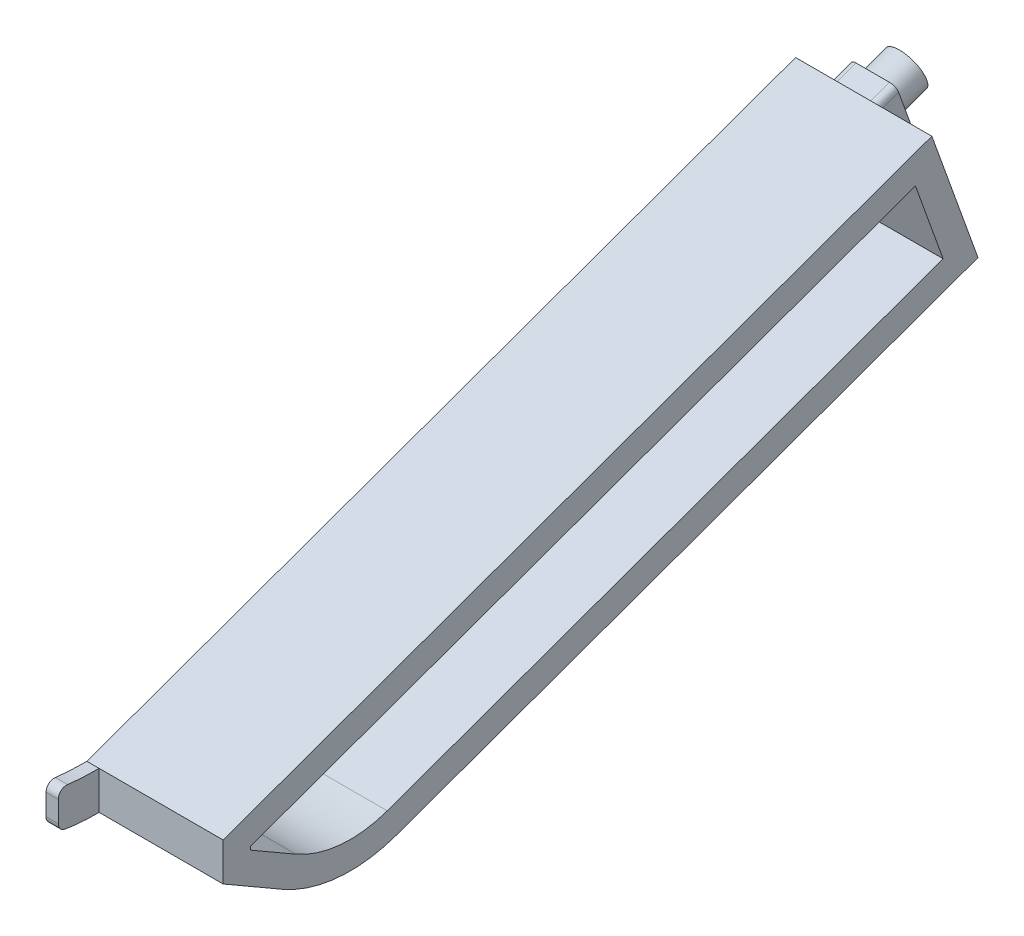
ISO-10303-21;
HEADER;
FILE_DESCRIPTION(('STEP AP214'),'2;1');
FILE_NAME('part.step','',(''),(''),'','','');
FILE_SCHEMA(('AUTOMOTIVE_DESIGN { 1 0 10303 214 1 1 1 1 }'));
ENDSEC;
DATA;
#1=APPLICATION_CONTEXT('core data for automotive mechanical design processes');
#2=APPLICATION_PROTOCOL_DEFINITION('international standard','automotive_design',2000,#1);
#3=PRODUCT_CONTEXT('',#1,'mechanical');
#4=PRODUCT('Part','Part','',(#3));
#5=PRODUCT_RELATED_PRODUCT_CATEGORY('part','',(#4));
#6=PRODUCT_DEFINITION_FORMATION('','',#4);
#7=PRODUCT_DEFINITION_CONTEXT('part definition',#1,'design');
#8=PRODUCT_DEFINITION('design','',#6,#7);
#9=PRODUCT_DEFINITION_SHAPE('','',#8);
#10=(LENGTH_UNIT() NAMED_UNIT(*) SI_UNIT(.MILLI.,.METRE.));
#11=(NAMED_UNIT(*) PLANE_ANGLE_UNIT() SI_UNIT($,.RADIAN.));
#12=(NAMED_UNIT(*) SI_UNIT($,.STERADIAN.) SOLID_ANGLE_UNIT());
#13=UNCERTAINTY_MEASURE_WITH_UNIT(LENGTH_MEASURE(1.E-05),#10,'distance_accuracy_value','');
#14=(GEOMETRIC_REPRESENTATION_CONTEXT(3) GLOBAL_UNCERTAINTY_ASSIGNED_CONTEXT((#13)) GLOBAL_UNIT_ASSIGNED_CONTEXT((#10,
#11,#12)) REPRESENTATION_CONTEXT('',''));
#15=CARTESIAN_POINT('',(0.,0.,0.));
#16=DIRECTION('',(0.,0.,1.));
#17=DIRECTION('',(1.,0.,0.));
#18=AXIS2_PLACEMENT_3D('',#15,#16,#17);
#19=CARTESIAN_POINT('',(0.,21.5231169644704,-52.00865823464));
#20=DIRECTION('',(0.,0.338719468272743,-0.940887411868727));
#21=DIRECTION('',(0.,0.940887411868727,0.338719468272743));
#22=AXIS2_PLACEMENT_3D('',#19,#20,#21);
#23=PLANE('',#22);
#24=DIRECTION('',(-1.,0.,0.));
#25=VECTOR('',#24,1.);
#26=CARTESIAN_POINT('',(3.46482322781408,15.1886756254264,-54.2890571166958));
#27=LINE('',#26,#25);
#28=CARTESIAN_POINT('',(2.96482322781408,15.1886756254264,-54.2890571166958));
#29=VERTEX_POINT('',#28);
#30=CARTESIAN_POINT('',(0.5,15.1886756254264,-54.2890571166958));
#31=VERTEX_POINT('',#30);
#32=EDGE_CURVE('E497',#29,#31,#27,.T.);
#33=ORIENTED_EDGE('',*,*,#32,.F.);
#34=CARTESIAN_POINT('',(2.96482322781408,15.6591193313608,-54.1196973825594));
#35=DIRECTION('',(0.,0.338719468272743,-0.940887411868727));
#36=DIRECTION('',(0.,0.940887411868727,0.338719468272743));
#37=AXIS2_PLACEMENT_3D('',#34,#35,#36);
#38=CIRCLE('',#37,0.5);
#39=CARTESIAN_POINT('',(3.46482322781408,15.6591193313608,-54.1196973825594));
#40=VERTEX_POINT('',#39);
#41=EDGE_CURVE('E491',#29,#40,#38,.F.);
#42=ORIENTED_EDGE('',*,*,#41,.T.);
#43=DIRECTION('',(0.,-0.940887411868726,-0.338719468272743));
#44=VECTOR('',#43,1.);
#45=CARTESIAN_POINT('',(3.46482322781408,15.1886756254264,-54.2890571166958));
#46=LINE('',#45,#44);
#47=CARTESIAN_POINT('',(3.46482322781408,17.9782404788927,-53.2848137694479));
#48=VERTEX_POINT('',#47);
#49=EDGE_CURVE('E507',#48,#40,#46,.T.);
#50=ORIENTED_EDGE('',*,*,#49,.F.);
#51=CARTESIAN_POINT('',(2.96482322781408,17.9782404788927,-53.2848137694479));
#52=DIRECTION('',(0.,0.338719468272743,-0.940887411868727));
#53=DIRECTION('',(0.,0.940887411868727,0.338719468272743));
#54=AXIS2_PLACEMENT_3D('',#51,#52,#53);
#55=CIRCLE('',#54,0.5);
#56=CARTESIAN_POINT('',(2.96482322781408,18.4486841848271,-53.1154540353116));
#57=VERTEX_POINT('',#56);
#58=EDGE_CURVE('E44',#48,#57,#55,.F.);
#59=ORIENTED_EDGE('',*,*,#58,.T.);
#60=DIRECTION('',(1.,0.,0.));
#61=VECTOR('',#60,1.);
#62=CARTESIAN_POINT('',(3.46482322781408,18.4486841848271,-53.1154540353116));
#63=LINE('',#62,#61);
#64=CARTESIAN_POINT('',(0.5,18.4486841848271,-53.1154540353116));
#65=VERTEX_POINT('',#64);
#66=EDGE_CURVE('E575',#65,#57,#63,.T.);
#67=ORIENTED_EDGE('',*,*,#66,.F.);
#68=CARTESIAN_POINT('',(0.5,17.9782404788927,-53.2848137694479));
#69=DIRECTION('',(0.,0.338719468272743,-0.940887411868727));
#70=DIRECTION('',(0.,0.940887411868727,0.338719468272743));
#71=AXIS2_PLACEMENT_3D('',#68,#69,#70);
#72=CIRCLE('',#71,0.5);
#73=CARTESIAN_POINT('',(0.,17.9782404788927,-53.2848137694479));
#74=VERTEX_POINT('',#73);
#75=EDGE_CURVE('E11',#65,#74,#72,.F.);
#76=ORIENTED_EDGE('',*,*,#75,.T.);
#77=DIRECTION('',(0.,-0.940887411868727,-0.338719468272743));
#78=VECTOR('',#77,1.);
#79=CARTESIAN_POINT('',(0.,12.1142428457831,-55.3958529173674));
#80=LINE('',#79,#78);
#81=CARTESIAN_POINT('',(0.,21.5231169644704,-52.00865823464));
#82=VERTEX_POINT('',#81);
#83=EDGE_CURVE('E416',#82,#74,#80,.T.);
#84=ORIENTED_EDGE('',*,*,#83,.F.);
#85=DIRECTION('',(1.,0.,0.));
#86=VECTOR('',#85,1.);
#87=CARTESIAN_POINT('',(-53.9186776176308,21.5231169644704,-52.00865823464));
#88=LINE('',#87,#86);
#89=CARTESIAN_POINT('',(10.,21.5231169644704,-52.00865823464));
#90=VERTEX_POINT('',#89);
#91=EDGE_CURVE('E413',#82,#90,#88,.T.);
#92=ORIENTED_EDGE('',*,*,#91,.T.);
#93=DIRECTION('',(0.,0.940887411868726,0.338719468272742));
#94=VECTOR('',#93,1.);
#95=CARTESIAN_POINT('',(10.,12.1142428457831,-55.3958529173674));
#96=LINE('',#95,#94);
#97=CARTESIAN_POINT('',(10.,12.1142428457831,-55.3958529173674));
#98=VERTEX_POINT('',#97);
#99=EDGE_CURVE('E412',#98,#90,#96,.T.);
#100=ORIENTED_EDGE('',*,*,#99,.F.);
#101=DIRECTION('',(1.,0.,0.));
#102=VECTOR('',#101,1.);
#103=CARTESIAN_POINT('',(-53.9186776176308,12.1142428457831,-55.3958529173674));
#104=LINE('',#103,#102);
#105=CARTESIAN_POINT('',(0.,12.1142428457831,-55.3958529173674));
#106=VERTEX_POINT('',#105);
#107=EDGE_CURVE('E409',#106,#98,#104,.T.);
#108=ORIENTED_EDGE('',*,*,#107,.F.);
#109=CARTESIAN_POINT('',(0.,15.6591193313608,-54.1196973825594));
#110=VERTEX_POINT('',#109);
#111=EDGE_CURVE('E400',#110,#106,#80,.T.);
#112=ORIENTED_EDGE('',*,*,#111,.F.);
#113=CARTESIAN_POINT('',(0.5,15.6591193313608,-54.1196973825594));
#114=DIRECTION('',(0.,0.338719468272743,-0.940887411868727));
#115=DIRECTION('',(0.,0.940887411868727,0.338719468272743));
#116=AXIS2_PLACEMENT_3D('',#113,#114,#115);
#117=CIRCLE('',#116,0.5);
#118=EDGE_CURVE('E493',#110,#31,#117,.F.);
#119=ORIENTED_EDGE('',*,*,#118,.T.);
#120=EDGE_LOOP('',(#33,#42,#50,#59,#67,#76,#84,#92,#100,#108,#112,#119));
#121=FACE_BOUND('',#120,.T.);
#122=ADVANCED_FACE('F36',(#121),#23,.T.);
#123=CARTESIAN_POINT('',(0.9,5.12842105263158,7.));
#124=CARTESIAN_POINT('',(0.9,1.73912121315182,6.10147264757334));
#125=CARTESIAN_POINT('',(0.9,0.,5.08826866536916));
#126=CARTESIAN_POINT('',(0.9,0.,0.));
#127=B_SPLINE_CURVE_WITH_KNOTS('',3,(#123,#124,#125,#126),.UNSPECIFIED.,.F.,.F.,(4,4),(0.,1.),.UNSPECIFIED.);
#128=DIRECTION('',(-1.,0.,0.));
#129=VECTOR('',#128,1.);
#130=SURFACE_OF_LINEAR_EXTRUSION('',#127,#129);
#131=CARTESIAN_POINT('',(0.9,0.191454914863101,2.50683189132577));
#132=VERTEX_POINT('',#131);
#133=CARTESIAN_POINT('',(0.9,0.,0.));
#134=VERTEX_POINT('',#133);
#135=EDGE_CURVE('E232',#132,#134,#127,.T.);
#136=ORIENTED_EDGE('',*,*,#135,.F.);
#137=DIRECTION('',(-1.,0.,0.));
#138=VECTOR('',#137,1.);
#139=CARTESIAN_POINT('',(0.9,0.191454914863133,2.50683189132595));
#140=LINE('',#139,#138);
#141=CARTESIAN_POINT('',(0.,0.191454914863101,2.50683189132577));
#142=VERTEX_POINT('',#141);
#143=EDGE_CURVE('E340',#132,#142,#140,.T.);
#144=ORIENTED_EDGE('',*,*,#143,.T.);
#145=CARTESIAN_POINT('',(0.,5.12842105263158,7.));
#146=CARTESIAN_POINT('',(0.,1.73912121315182,6.10147264757334));
#147=CARTESIAN_POINT('',(0.,0.,5.08826866536916));
#148=CARTESIAN_POINT('',(0.,0.,0.));
#149=B_SPLINE_CURVE_WITH_KNOTS('',3,(#145,#146,#147,#148),.UNSPECIFIED.,.F.,.F.,(4,4),(0.,1.),.UNSPECIFIED.);
#150=CARTESIAN_POINT('',(0.,0.,0.));
#151=VERTEX_POINT('',#150);
#152=EDGE_CURVE('E241',#142,#151,#149,.T.);
#153=ORIENTED_EDGE('',*,*,#152,.T.);
#154=DIRECTION('',(-1.,0.,0.));
#155=VECTOR('',#154,1.);
#156=CARTESIAN_POINT('',(0.9,0.,0.));
#157=LINE('',#156,#155);
#158=EDGE_CURVE('E234',#134,#151,#157,.T.);
#159=ORIENTED_EDGE('',*,*,#158,.F.);
#160=EDGE_LOOP('',(#136,#144,#153,#159));
#161=FACE_BOUND('',#160,.T.);
#162=ADVANCED_FACE('F256',(#161),#130,.F.);
#163=CARTESIAN_POINT('',(0.9,2.8,0.));
#164=CARTESIAN_POINT('',(0.9,2.8,3.6542139346842));
#165=CARTESIAN_POINT('',(0.9,3.43377073977233,4.55418302304701));
#166=CARTESIAN_POINT('',(0.9,5.12842105263158,7.));
#167=B_SPLINE_CURVE_WITH_KNOTS('',3,(#163,#164,#165,#166),.UNSPECIFIED.,.F.,.F.,(4,4),(0.,1.),.UNSPECIFIED.);
#168=DIRECTION('',(-1.,0.,0.));
#169=VECTOR('',#168,1.);
#170=SURFACE_OF_LINEAR_EXTRUSION('',#167,#169);
#171=CARTESIAN_POINT('',(0.,2.8,0.));
#172=CARTESIAN_POINT('',(0.,2.8,3.6542139346842));
#173=CARTESIAN_POINT('',(0.,3.43377073977233,4.55418302304701));
#174=CARTESIAN_POINT('',(0.,5.12842105263158,7.));
#175=B_SPLINE_CURVE_WITH_KNOTS('',3,(#171,#172,#173,#174),.UNSPECIFIED.,.F.,.F.,(4,4),(0.,1.),.UNSPECIFIED.);
#176=CARTESIAN_POINT('',(0.,2.8,0.));
#177=VERTEX_POINT('',#176);
#178=CARTESIAN_POINT('',(0.,2.92915290222251,2.31818913175958));
#179=VERTEX_POINT('',#178);
#180=EDGE_CURVE('E223',#177,#179,#175,.T.);
#181=ORIENTED_EDGE('',*,*,#180,.T.);
#182=DIRECTION('',(-1.,0.,0.));
#183=VECTOR('',#182,1.);
#184=CARTESIAN_POINT('',(0.,2.92915290222251,2.31818913175958));
#185=LINE('',#184,#183);
#186=CARTESIAN_POINT('',(0.9,2.92915290222251,2.31818913175958));
#187=VERTEX_POINT('',#186);
#188=EDGE_CURVE('E207',#179,#187,#185,.F.);
#189=ORIENTED_EDGE('',*,*,#188,.T.);
#190=CARTESIAN_POINT('',(0.9,2.8,0.));
#191=VERTEX_POINT('',#190);
#192=EDGE_CURVE('E221',#191,#187,#167,.T.);
#193=ORIENTED_EDGE('',*,*,#192,.F.);
#194=DIRECTION('',(-1.,0.,0.));
#195=VECTOR('',#194,1.);
#196=CARTESIAN_POINT('',(0.9,2.8,0.));
#197=LINE('',#196,#195);
#198=EDGE_CURVE('E230',#191,#177,#197,.T.);
#199=ORIENTED_EDGE('',*,*,#198,.T.);
#200=EDGE_LOOP('',(#181,#189,#193,#199));
#201=FACE_BOUND('',#200,.T.);
#202=ADVANCED_FACE('F219',(#201),#170,.F.);
#203=CARTESIAN_POINT('',(0.9,1.29322308651088,5.07115299235344));
#204=DIRECTION('',(1.,0.,0.));
#205=DIRECTION('',(0.,0.,-1.));
#206=AXIS2_PLACEMENT_3D('',#203,#204,#205);
#207=PLANE('',#206);
#208=DIRECTION('',(0.,1.,0.));
#209=VECTOR('',#208,1.);
#210=CARTESIAN_POINT('',(0.9,1.29322308651088,3.));
#211=LINE('',#210,#209);
#212=CARTESIAN_POINT('',(0.9,0.781867437592555,3.));
#213=VERTEX_POINT('',#212);
#214=CARTESIAN_POINT('',(0.9,2.33475658507565,3.));
#215=VERTEX_POINT('',#214);
#216=EDGE_CURVE('E459',#213,#215,#211,.T.);
#217=ORIENTED_EDGE('',*,*,#216,.F.);
#218=CARTESIAN_POINT('',(0.9,0.781867437592555,2.4));
#219=DIRECTION('',(1.,0.,0.));
#220=DIRECTION('',(0.,0.,-1.));
#221=AXIS2_PLACEMENT_3D('',#218,#219,#220);
#222=CIRCLE('',#221,0.6);
#223=EDGE_CURVE('E214',#213,#132,#222,.T.);
#224=ORIENTED_EDGE('',*,*,#223,.T.);
#225=ORIENTED_EDGE('',*,*,#135,.T.);
#226=DIRECTION('',(0.,1.,0.));
#227=VECTOR('',#226,1.);
#228=CARTESIAN_POINT('',(0.9,2.8,0.));
#229=LINE('',#228,#227);
#230=EDGE_CURVE('E229',#134,#191,#229,.T.);
#231=ORIENTED_EDGE('',*,*,#230,.T.);
#232=ORIENTED_EDGE('',*,*,#192,.T.);
#233=CARTESIAN_POINT('',(0.9,2.33475658507565,2.4));
#234=DIRECTION('',(1.,0.,0.));
#235=DIRECTION('',(0.,0.,-1.));
#236=AXIS2_PLACEMENT_3D('',#233,#234,#235);
#237=CIRCLE('',#236,0.6);
#238=EDGE_CURVE('E203',#187,#215,#237,.T.);
#239=ORIENTED_EDGE('',*,*,#238,.T.);
#240=EDGE_LOOP('',(#217,#224,#225,#231,#232,#239));
#241=FACE_BOUND('',#240,.T.);
#242=ADVANCED_FACE('F227',(#241),#207,.T.);
#243=CARTESIAN_POINT('',(0.,1.29322308651088,5.07115299235344));
#244=DIRECTION('',(1.,0.,0.));
#245=DIRECTION('',(0.,0.,-1.));
#246=AXIS2_PLACEMENT_3D('',#243,#244,#245);
#247=PLANE('',#246);
#248=DIRECTION('',(0.,-0.338719468272742,0.940887411868727));
#249=VECTOR('',#248,1.);
#250=CARTESIAN_POINT('',(0.,-0.870809318457205,4.29210132656493));
#251=LINE('',#250,#249);
#252=CARTESIAN_POINT('',(0.,18.9639032041874,-50.804322347448));
#253=VERTEX_POINT('',#252);
#254=CARTESIAN_POINT('',(0.,1.39434715910617,-2.));
#255=VERTEX_POINT('',#254);
#256=EDGE_CURVE('E431',#253,#255,#251,.T.);
#257=ORIENTED_EDGE('',*,*,#256,.T.);
#258=DIRECTION('',(0.,-1.,0.));
#259=VECTOR('',#258,1.);
#260=CARTESIAN_POINT('',(0.,1.29322308651088,-2.));
#261=LINE('',#260,#259);
#262=CARTESIAN_POINT('',(0.,1.15470053837925,-2.));
#263=VERTEX_POINT('',#262);
#264=EDGE_CURVE('E421',#255,#263,#261,.T.);
#265=ORIENTED_EDGE('',*,*,#264,.T.);
#266=DIRECTION('',(0.,-0.500000000000001,-0.866025403784438));
#267=VECTOR('',#266,1.);
#268=CARTESIAN_POINT('',(0.,4.25123023812438,3.36334676710454));
#269=LINE('',#268,#267);
#270=CARTESIAN_POINT('',(0.,-0.768816625641934,-5.33162945731548));
#271=VERTEX_POINT('',#270);
#272=EDGE_CURVE('E360',#263,#271,#269,.T.);
#273=ORIENTED_EDGE('',*,*,#272,.T.);
#274=CARTESIAN_POINT('',(0.,6.15938660463357,-9.33162945731548));
#275=DIRECTION('',(1.,0.,0.));
#276=DIRECTION('',(0.,0.,-1.));
#277=AXIS2_PLACEMENT_3D('',#274,#275,#276);
#278=CIRCLE('',#277,8.);
#279=CARTESIAN_POINT('',(0.,-1.36771269031624,-12.0413852034974));
#280=VERTEX_POINT('',#279);
#281=EDGE_CURVE('E357',#271,#280,#278,.T.);
#282=ORIENTED_EDGE('',*,*,#281,.T.);
#283=DIRECTION('',(0.,0.338719468272742,-0.940887411868727));
#284=VECTOR('',#283,1.);
#285=CARTESIAN_POINT('',(0.,-6.51613378966956,2.25978451692848));
#286=LINE('',#285,#284);
#287=CARTESIAN_POINT('',(0.,13.3185787329751,-52.8366391570844));
#288=VERTEX_POINT('',#287);
#289=EDGE_CURVE('E361',#280,#288,#286,.T.);
#290=ORIENTED_EDGE('',*,*,#289,.T.);
#291=DIRECTION('',(0.,0.940887411868726,0.338719468272743));
#292=VECTOR('',#291,1.);
#293=CARTESIAN_POINT('',(0.,21.1279356091556,-50.0252706816594));
#294=LINE('',#293,#292);
#295=EDGE_CURVE('E364',#288,#253,#294,.T.);
#296=ORIENTED_EDGE('',*,*,#295,.T.);
#297=EDGE_LOOP('',(#257,#265,#273,#282,#290,#296));
#298=FACE_BOUND('',#297,.T.);
#299=DIRECTION('',(0.,0.940887411868726,0.338719468272743));
#300=VECTOR('',#299,1.);
#301=CARTESIAN_POINT('',(0.,16.2048340302447,-57.111719352302));
#302=LINE('',#301,#300);
#303=CARTESIAN_POINT('',(0.,16.675277736179,-56.9423596181656));
#304=VERTEX_POINT('',#303);
#305=CARTESIAN_POINT('',(0.,18.9943988837109,-56.1074760050541));
#306=VERTEX_POINT('',#305);
#307=EDGE_CURVE('E514',#304,#306,#302,.T.);
#308=ORIENTED_EDGE('',*,*,#307,.F.);
#309=DIRECTION('',(0.,-0.338719468272743,0.940887411868727));
#310=VECTOR('',#309,1.);
#311=CARTESIAN_POINT('',(0.,-4.8530321278294,2.85850111519093));
#312=LINE('',#311,#310);
#313=EDGE_CURVE('E484',#304,#110,#312,.T.);
#314=ORIENTED_EDGE('',*,*,#313,.T.);
#315=ORIENTED_EDGE('',*,*,#111,.T.);
#316=DIRECTION('',(0.,-0.338719468272742,0.940887411868727));
#317=VECTOR('',#316,1.);
#318=CARTESIAN_POINT('',(0.,-4.82173056785397,-8.35148232393102));
#319=LINE('',#318,#317);
#320=CARTESIAN_POINT('',(0.,-3.2494875140537,-12.7188241400429));
#321=VERTEX_POINT('',#320);
#322=EDGE_CURVE('E397',#106,#321,#319,.T.);
#323=ORIENTED_EDGE('',*,*,#322,.T.);
#324=CARTESIAN_POINT('',(0.,6.15938660463357,-9.33162945731548));
#325=DIRECTION('',(1.,0.,0.));
#326=DIRECTION('',(0.,0.,-1.));
#327=AXIS2_PLACEMENT_3D('',#324,#325,#326);
#328=CIRCLE('',#327,10.);
#329=CARTESIAN_POINT('',(0.,-2.50086743321081,-4.33162945731547));
#330=VERTEX_POINT('',#329);
#331=EDGE_CURVE('E349',#321,#330,#328,.F.);
#332=ORIENTED_EDGE('',*,*,#331,.T.);
#333=DIRECTION('',(0.,-0.500000000000001,-0.866025403784438));
#334=VECTOR('',#333,1.);
#335=CARTESIAN_POINT('',(0.,0.,0.));
#336=LINE('',#335,#334);
#337=EDGE_CURVE('E391',#151,#330,#336,.T.);
#338=ORIENTED_EDGE('',*,*,#337,.F.);
#339=ORIENTED_EDGE('',*,*,#152,.F.);
#340=CARTESIAN_POINT('',(0.,0.781867437592555,2.4));
#341=DIRECTION('',(1.,0.,0.));
#342=DIRECTION('',(0.,0.,-1.));
#343=AXIS2_PLACEMENT_3D('',#340,#341,#342);
#344=CIRCLE('',#343,0.6);
#345=CARTESIAN_POINT('',(0.,0.781867437592555,3.));
#346=VERTEX_POINT('',#345);
#347=EDGE_CURVE('E348',#142,#346,#344,.F.);
#348=ORIENTED_EDGE('',*,*,#347,.T.);
#349=DIRECTION('',(0.,-1.,0.));
#350=VECTOR('',#349,1.);
#351=CARTESIAN_POINT('',(0.,-0.988739395943905,3.));
#352=LINE('',#351,#350);
#353=CARTESIAN_POINT('',(0.,2.33475658507565,3.));
#354=VERTEX_POINT('',#353);
#355=EDGE_CURVE('E461',#354,#346,#352,.T.);
#356=ORIENTED_EDGE('',*,*,#355,.F.);
#357=CARTESIAN_POINT('',(0.,2.33475658507565,2.4));
#358=DIRECTION('',(1.,0.,0.));
#359=DIRECTION('',(0.,0.,-1.));
#360=AXIS2_PLACEMENT_3D('',#357,#358,#359);
#361=CIRCLE('',#360,0.6);
#362=EDGE_CURVE('E350',#354,#179,#361,.F.);
#363=ORIENTED_EDGE('',*,*,#362,.T.);
#364=ORIENTED_EDGE('',*,*,#180,.F.);
#365=DIRECTION('',(0.,-0.338719468272742,0.940887411868727));
#366=VECTOR('',#365,1.);
#367=CARTESIAN_POINT('',(0.,10.,-20.));
#368=LINE('',#367,#366);
#369=EDGE_CURVE('E403',#82,#177,#368,.T.);
#370=ORIENTED_EDGE('',*,*,#369,.F.);
#371=ORIENTED_EDGE('',*,*,#83,.T.);
#372=DIRECTION('',(0.,-0.338719468272743,0.940887411868727));
#373=VECTOR('',#372,1.);
#374=CARTESIAN_POINT('',(0.,-2.53391098029749,3.69338472830242));
#375=LINE('',#374,#373);
#376=EDGE_CURVE('E482',#74,#306,#375,.F.);
#377=ORIENTED_EDGE('',*,*,#376,.T.);
#378=EDGE_LOOP('',(#308,#314,#315,#323,#332,#338,#339,#348,#356,#363,#364,#370,#371,#377));
#379=FACE_BOUND('',#378,.T.);
#380=ADVANCED_FACE('F258',(#298,#379),#247,.F.);
#381=CARTESIAN_POINT('',(10.,2.8,0.));
#382=DIRECTION('',(0.,0.,-1.));
#383=DIRECTION('',(-1.,0.,0.));
#384=AXIS2_PLACEMENT_3D('',#381,#382,#383);
#385=PLANE('',#384);
#386=ORIENTED_EDGE('',*,*,#230,.F.);
#387=DIRECTION('',(-1.,0.,0.));
#388=VECTOR('',#387,1.);
#389=CARTESIAN_POINT('',(10.,0.,0.));
#390=LINE('',#389,#388);
#391=CARTESIAN_POINT('',(10.,0.,0.));
#392=VERTEX_POINT('',#391);
#393=EDGE_CURVE('E381',#392,#134,#390,.T.);
#394=ORIENTED_EDGE('',*,*,#393,.F.);
#395=DIRECTION('',(0.,-1.,0.));
#396=VECTOR('',#395,1.);
#397=CARTESIAN_POINT('',(10.,2.8,0.));
#398=LINE('',#397,#396);
#399=CARTESIAN_POINT('',(10.,2.8,0.));
#400=VERTEX_POINT('',#399);
#401=EDGE_CURVE('E406',#400,#392,#398,.T.);
#402=ORIENTED_EDGE('',*,*,#401,.F.);
#403=DIRECTION('',(-1.,0.,0.));
#404=VECTOR('',#403,1.);
#405=CARTESIAN_POINT('',(10.,2.8,0.));
#406=LINE('',#405,#404);
#407=EDGE_CURVE('E382',#400,#191,#406,.T.);
#408=ORIENTED_EDGE('',*,*,#407,.T.);
#409=EDGE_LOOP('',(#386,#394,#402,#408));
#410=FACE_BOUND('',#409,.T.);
#411=ADVANCED_FACE('F261',(#410),#385,.F.);
#412=CARTESIAN_POINT('',(10.,10.,-20.));
#413=DIRECTION('',(0.,-0.940887411868727,-0.338719468272742));
#414=DIRECTION('',(0.,0.338719468272742,-0.940887411868727));
#415=AXIS2_PLACEMENT_3D('',#412,#413,#414);
#416=PLANE('',#415);
#417=ORIENTED_EDGE('',*,*,#369,.T.);
#418=ORIENTED_EDGE('',*,*,#198,.F.);
#419=ORIENTED_EDGE('',*,*,#407,.F.);
#420=DIRECTION('',(0.,-0.338719468272742,0.940887411868727));
#421=VECTOR('',#420,1.);
#422=CARTESIAN_POINT('',(10.,10.,-20.));
#423=LINE('',#422,#421);
#424=EDGE_CURVE('E533',#90,#400,#423,.T.);
#425=ORIENTED_EDGE('',*,*,#424,.F.);
#426=ORIENTED_EDGE('',*,*,#91,.F.);
#427=EDGE_LOOP('',(#417,#418,#419,#425,#426));
#428=FACE_BOUND('',#427,.T.);
#429=ADVANCED_FACE('F267',(#428),#416,.F.);
#430=CARTESIAN_POINT('',(10.,0.,0.));
#431=DIRECTION('',(1.,0.,0.));
#432=DIRECTION('',(0.,0.,-1.));
#433=AXIS2_PLACEMENT_3D('',#430,#431,#432);
#434=PLANE('',#433);
#435=DIRECTION('',(0.,-1.,0.));
#436=VECTOR('',#435,1.);
#437=CARTESIAN_POINT('',(10.,1.39434715910617,-2.));
#438=LINE('',#437,#436);
#439=CARTESIAN_POINT('',(10.,1.39434715910617,-2.));
#440=VERTEX_POINT('',#439);
#441=CARTESIAN_POINT('',(10.,1.15470053837925,-2.));
#442=VERTEX_POINT('',#441);
#443=EDGE_CURVE('E457',#440,#442,#438,.T.);
#444=ORIENTED_EDGE('',*,*,#443,.F.);
#445=DIRECTION('',(0.,-0.338719468272742,0.940887411868727));
#446=VECTOR('',#445,1.);
#447=CARTESIAN_POINT('',(10.,18.9639032041874,-50.804322347448));
#448=LINE('',#447,#446);
#449=CARTESIAN_POINT('',(10.,18.9639032041874,-50.804322347448));
#450=VERTEX_POINT('',#449);
#451=EDGE_CURVE('E438',#450,#440,#448,.T.);
#452=ORIENTED_EDGE('',*,*,#451,.F.);
#453=DIRECTION('',(0.,0.940887411868726,0.338719468272743));
#454=VECTOR('',#453,1.);
#455=CARTESIAN_POINT('',(10.,13.3185787329751,-52.8366391570844));
#456=LINE('',#455,#454);
#457=CARTESIAN_POINT('',(10.,13.3185787329751,-52.8366391570844));
#458=VERTEX_POINT('',#457);
#459=EDGE_CURVE('E445',#458,#450,#456,.T.);
#460=ORIENTED_EDGE('',*,*,#459,.F.);
#461=DIRECTION('',(0.,0.338719468272741,-0.940887411868727));
#462=VECTOR('',#461,1.);
#463=CARTESIAN_POINT('',(10.,-1.36771269031624,-12.0413852034974));
#464=LINE('',#463,#462);
#465=CARTESIAN_POINT('',(10.,-1.36771269031624,-12.0413852034974));
#466=VERTEX_POINT('',#465);
#467=EDGE_CURVE('E448',#466,#458,#464,.T.);
#468=ORIENTED_EDGE('',*,*,#467,.F.);
#469=CARTESIAN_POINT('',(10.,6.15938660463357,-9.33162945731548));
#470=DIRECTION('',(1.,0.,0.));
#471=DIRECTION('',(0.,0.,-1.));
#472=AXIS2_PLACEMENT_3D('',#469,#470,#471);
#473=CIRCLE('',#472,8.);
#474=CARTESIAN_POINT('',(10.,-0.768816625641933,-5.33162945731548));
#475=VERTEX_POINT('',#474);
#476=EDGE_CURVE('E451',#475,#466,#473,.T.);
#477=ORIENTED_EDGE('',*,*,#476,.F.);
#478=DIRECTION('',(0.,-0.500000000000001,-0.866025403784438));
#479=VECTOR('',#478,1.);
#480=CARTESIAN_POINT('',(10.,1.15470053837925,-2.));
#481=LINE('',#480,#479);
#482=EDGE_CURVE('E454',#442,#475,#481,.T.);
#483=ORIENTED_EDGE('',*,*,#482,.F.);
#484=EDGE_LOOP('',(#444,#452,#460,#468,#477,#483));
#485=FACE_BOUND('',#484,.T.);
#486=DIRECTION('',(0.,-0.500000000000001,-0.866025403784438));
#487=VECTOR('',#486,1.);
#488=CARTESIAN_POINT('',(10.,0.,0.));
#489=LINE('',#488,#487);
#490=CARTESIAN_POINT('',(10.,-2.50086743321081,-4.33162945731547));
#491=VERTEX_POINT('',#490);
#492=EDGE_CURVE('E398',#392,#491,#489,.T.);
#493=ORIENTED_EDGE('',*,*,#492,.T.);
#494=CARTESIAN_POINT('',(10.,6.15938660463357,-9.33162945731548));
#495=DIRECTION('',(1.,0.,0.));
#496=DIRECTION('',(0.,0.,-1.));
#497=AXIS2_PLACEMENT_3D('',#494,#495,#496);
#498=CIRCLE('',#497,10.);
#499=CARTESIAN_POINT('',(10.,-3.2494875140537,-12.7188241400429));
#500=VERTEX_POINT('',#499);
#501=EDGE_CURVE('E369',#491,#500,#498,.T.);
#502=ORIENTED_EDGE('',*,*,#501,.T.);
#503=DIRECTION('',(0.,0.338719468272742,-0.940887411868727));
#504=VECTOR('',#503,1.);
#505=CARTESIAN_POINT('',(10.,-4.82173056785397,-8.35148232393102));
#506=LINE('',#505,#504);
#507=EDGE_CURVE('E419',#500,#98,#506,.T.);
#508=ORIENTED_EDGE('',*,*,#507,.T.);
#509=ORIENTED_EDGE('',*,*,#99,.T.);
#510=ORIENTED_EDGE('',*,*,#424,.T.);
#511=ORIENTED_EDGE('',*,*,#401,.T.);
#512=EDGE_LOOP('',(#493,#502,#508,#509,#510,#511));
#513=FACE_BOUND('',#512,.T.);
#514=ADVANCED_FACE('F271',(#485,#513),#434,.T.);
#515=CARTESIAN_POINT('',(10.,0.,0.));
#516=DIRECTION('',(0.,0.866025403784438,-0.500000000000001));
#517=DIRECTION('',(0.,0.500000000000001,0.866025403784438));
#518=AXIS2_PLACEMENT_3D('',#515,#516,#517);
#519=PLANE('',#518);
#520=ORIENTED_EDGE('',*,*,#337,.T.);
#521=DIRECTION('',(1.,0.,0.));
#522=VECTOR('',#521,1.);
#523=CARTESIAN_POINT('',(10.,-2.50086743321081,-4.33162945731548));
#524=LINE('',#523,#522);
#525=EDGE_CURVE('E371',#330,#491,#524,.T.);
#526=ORIENTED_EDGE('',*,*,#525,.T.);
#527=ORIENTED_EDGE('',*,*,#492,.F.);
#528=ORIENTED_EDGE('',*,*,#393,.T.);
#529=ORIENTED_EDGE('',*,*,#158,.T.);
#530=EDGE_LOOP('',(#520,#526,#527,#528,#529));
#531=FACE_BOUND('',#530,.T.);
#532=ADVANCED_FACE('F275',(#531),#519,.F.);
#533=CARTESIAN_POINT('',(-53.9186776176308,-4.82173056785397,-8.35148232393102));
#534=DIRECTION('',(0.,-0.940887411868727,-0.338719468272742));
#535=DIRECTION('',(0.,0.338719468272742,-0.940887411868727));
#536=AXIS2_PLACEMENT_3D('',#533,#534,#535);
#537=PLANE('',#536);
#538=ORIENTED_EDGE('',*,*,#507,.F.);
#539=DIRECTION('',(1.,0.,0.));
#540=VECTOR('',#539,1.);
#541=CARTESIAN_POINT('',(0.,-3.24948751405369,-12.7188241400429));
#542=LINE('',#541,#540);
#543=EDGE_CURVE('E352',#500,#321,#542,.F.);
#544=ORIENTED_EDGE('',*,*,#543,.T.);
#545=ORIENTED_EDGE('',*,*,#322,.F.);
#546=ORIENTED_EDGE('',*,*,#107,.T.);
#547=EDGE_LOOP('',(#538,#544,#545,#546));
#548=FACE_BOUND('',#547,.T.);
#549=ADVANCED_FACE('F279',(#548),#537,.T.);
#550=CARTESIAN_POINT('',(10.,6.15938660463357,-9.33162945731548));
#551=DIRECTION('',(-1.,0.,0.));
#552=DIRECTION('',(0.,0.,1.));
#553=AXIS2_PLACEMENT_3D('',#550,#551,#552);
#554=CYLINDRICAL_SURFACE('',#553,10.);
#555=ORIENTED_EDGE('',*,*,#331,.F.);
#556=ORIENTED_EDGE('',*,*,#543,.F.);
#557=ORIENTED_EDGE('',*,*,#501,.F.);
#558=ORIENTED_EDGE('',*,*,#525,.F.);
#559=EDGE_LOOP('',(#555,#556,#557,#558));
#560=FACE_BOUND('',#559,.T.);
#561=ADVANCED_FACE('F283',(#560),#554,.T.);
#562=CARTESIAN_POINT('',(-2.50000000007189E-05,1.39434715910617,-2.));
#563=DIRECTION('',(0.,0.,1.));
#564=DIRECTION('',(1.,0.,0.));
#565=AXIS2_PLACEMENT_3D('',#562,#563,#564);
#566=PLANE('',#565);
#567=DIRECTION('',(1.,0.,0.));
#568=VECTOR('',#567,1.);
#569=CARTESIAN_POINT('',(-2.50000000007189E-05,1.39434715910617,-2.));
#570=LINE('',#569,#568);
#571=EDGE_CURVE('E366',#255,#440,#570,.T.);
#572=ORIENTED_EDGE('',*,*,#571,.T.);
#573=ORIENTED_EDGE('',*,*,#443,.T.);
#574=DIRECTION('',(1.,0.,0.));
#575=VECTOR('',#574,1.);
#576=CARTESIAN_POINT('',(-2.50000000007189E-05,1.15470053837925,-2.));
#577=LINE('',#576,#575);
#578=EDGE_CURVE('E428',#263,#442,#577,.T.);
#579=ORIENTED_EDGE('',*,*,#578,.F.);
#580=ORIENTED_EDGE('',*,*,#264,.F.);
#581=EDGE_LOOP('',(#572,#573,#579,#580));
#582=FACE_BOUND('',#581,.T.);
#583=ADVANCED_FACE('F285',(#582),#566,.F.);
#584=CARTESIAN_POINT('',(-2.50000000007189E-05,18.9639032041874,-50.804322347448));
#585=DIRECTION('',(0.,0.940887411868727,0.338719468272742));
#586=DIRECTION('',(0.,-0.338719468272742,0.940887411868727));
#587=AXIS2_PLACEMENT_3D('',#584,#585,#586);
#588=PLANE('',#587);
#589=DIRECTION('',(1.,0.,0.));
#590=VECTOR('',#589,1.);
#591=CARTESIAN_POINT('',(-2.50000000007189E-05,18.9639032041874,-50.804322347448));
#592=LINE('',#591,#590);
#593=EDGE_CURVE('E440',#253,#450,#592,.T.);
#594=ORIENTED_EDGE('',*,*,#593,.T.);
#595=ORIENTED_EDGE('',*,*,#451,.T.);
#596=ORIENTED_EDGE('',*,*,#571,.F.);
#597=ORIENTED_EDGE('',*,*,#256,.F.);
#598=EDGE_LOOP('',(#594,#595,#596,#597));
#599=FACE_BOUND('',#598,.T.);
#600=ADVANCED_FACE('F288',(#599),#588,.F.);
#601=CARTESIAN_POINT('',(-2.50000000007189E-05,13.3185787329751,-52.8366391570844));
#602=DIRECTION('',(0.,0.338719468272743,-0.940887411868726));
#603=DIRECTION('',(0.,0.940887411868726,0.338719468272743));
#604=AXIS2_PLACEMENT_3D('',#601,#602,#603);
#605=PLANE('',#604);
#606=DIRECTION('',(1.,0.,0.));
#607=VECTOR('',#606,1.);
#608=CARTESIAN_POINT('',(-2.50000000007189E-05,13.3185787329751,-52.8366391570844));
#609=LINE('',#608,#607);
#610=EDGE_CURVE('E426',#288,#458,#609,.T.);
#611=ORIENTED_EDGE('',*,*,#610,.T.);
#612=ORIENTED_EDGE('',*,*,#459,.T.);
#613=ORIENTED_EDGE('',*,*,#593,.F.);
#614=ORIENTED_EDGE('',*,*,#295,.F.);
#615=EDGE_LOOP('',(#611,#612,#613,#614));
#616=FACE_BOUND('',#615,.T.);
#617=ADVANCED_FACE('F302',(#616),#605,.F.);
#618=CARTESIAN_POINT('',(-2.50000000007189E-05,-1.36771269031624,-12.0413852034974));
#619=DIRECTION('',(0.,-0.940887411868727,-0.338719468272741));
#620=DIRECTION('',(0.,0.338719468272742,-0.940887411868727));
#621=AXIS2_PLACEMENT_3D('',#618,#619,#620);
#622=PLANE('',#621);
#623=DIRECTION('',(1.,0.,0.));
#624=VECTOR('',#623,1.);
#625=CARTESIAN_POINT('',(-2.50000000007189E-05,-1.36771269031624,-12.0413852034974));
#626=LINE('',#625,#624);
#627=EDGE_CURVE('E423',#280,#466,#626,.T.);
#628=ORIENTED_EDGE('',*,*,#627,.T.);
#629=ORIENTED_EDGE('',*,*,#467,.T.);
#630=ORIENTED_EDGE('',*,*,#610,.F.);
#631=ORIENTED_EDGE('',*,*,#289,.F.);
#632=EDGE_LOOP('',(#628,#629,#630,#631));
#633=FACE_BOUND('',#632,.T.);
#634=ADVANCED_FACE('F298',(#633),#622,.F.);
#635=CARTESIAN_POINT('',(-2.50000000007189E-05,6.15938660463357,-9.33162945731548));
#636=DIRECTION('',(1.,0.,0.));
#637=DIRECTION('',(0.,0.,-1.));
#638=AXIS2_PLACEMENT_3D('',#635,#636,#637);
#639=CYLINDRICAL_SURFACE('',#638,8.);
#640=DIRECTION('',(1.,0.,0.));
#641=VECTOR('',#640,1.);
#642=CARTESIAN_POINT('',(-2.50000000007189E-05,-0.768816625641933,-5.33162945731548));
#643=LINE('',#642,#641);
#644=EDGE_CURVE('E425',#271,#475,#643,.T.);
#645=ORIENTED_EDGE('',*,*,#644,.T.);
#646=ORIENTED_EDGE('',*,*,#476,.T.);
#647=ORIENTED_EDGE('',*,*,#627,.F.);
#648=ORIENTED_EDGE('',*,*,#281,.F.);
#649=EDGE_LOOP('',(#645,#646,#647,#648));
#650=FACE_BOUND('',#649,.T.);
#651=ADVANCED_FACE('F294',(#650),#639,.F.);
#652=CARTESIAN_POINT('',(-2.50000000007189E-05,1.15470053837925,-2.));
#653=DIRECTION('',(0.,-0.866025403784438,0.500000000000001));
#654=DIRECTION('',(0.,-0.500000000000001,-0.866025403784438));
#655=AXIS2_PLACEMENT_3D('',#652,#653,#654);
#656=PLANE('',#655);
#657=ORIENTED_EDGE('',*,*,#578,.T.);
#658=ORIENTED_EDGE('',*,*,#482,.T.);
#659=ORIENTED_EDGE('',*,*,#644,.F.);
#660=ORIENTED_EDGE('',*,*,#272,.F.);
#661=EDGE_LOOP('',(#657,#658,#659,#660));
#662=FACE_BOUND('',#661,.T.);
#663=ADVANCED_FACE('F290',(#662),#656,.F.);
#664=CARTESIAN_POINT('',(10.000025,-0.988739395943905,3.));
#665=DIRECTION('',(0.,0.,-1.));
#666=DIRECTION('',(0.,1.,0.));
#667=AXIS2_PLACEMENT_3D('',#664,#665,#666);
#668=PLANE('',#667);
#669=ORIENTED_EDGE('',*,*,#355,.T.);
#670=DIRECTION('',(-1.,0.,0.));
#671=VECTOR('',#670,1.);
#672=CARTESIAN_POINT('',(10.000025,0.781867437592555,3.));
#673=LINE('',#672,#671);
#674=EDGE_CURVE('E213',#346,#213,#673,.F.);
#675=ORIENTED_EDGE('',*,*,#674,.T.);
#676=ORIENTED_EDGE('',*,*,#216,.T.);
#677=DIRECTION('',(-1.,0.,0.));
#678=VECTOR('',#677,1.);
#679=CARTESIAN_POINT('',(10.000025,2.33475658507565,3.));
#680=LINE('',#679,#678);
#681=EDGE_CURVE('E208',#215,#354,#680,.T.);
#682=ORIENTED_EDGE('',*,*,#681,.T.);
#683=EDGE_LOOP('',(#669,#675,#676,#682));
#684=FACE_BOUND('',#683,.T.);
#685=ADVANCED_FACE('F293',(#684),#668,.F.);
#686=CARTESIAN_POINT('',(0.45,0.781867437592555,2.4));
#687=DIRECTION('',(-1.,0.,0.));
#688=DIRECTION('',(0.,0.,1.));
#689=AXIS2_PLACEMENT_3D('',#686,#687,#688);
#690=CYLINDRICAL_SURFACE('',#689,0.6);
#691=ORIENTED_EDGE('',*,*,#223,.F.);
#692=ORIENTED_EDGE('',*,*,#674,.F.);
#693=ORIENTED_EDGE('',*,*,#347,.F.);
#694=ORIENTED_EDGE('',*,*,#143,.F.);
#695=EDGE_LOOP('',(#691,#692,#693,#694));
#696=FACE_BOUND('',#695,.T.);
#697=ADVANCED_FACE('F312',(#696),#690,.T.);
#698=CARTESIAN_POINT('',(0.45,2.33475658507565,2.4));
#699=DIRECTION('',(-1.,0.,0.));
#700=DIRECTION('',(0.,0.,1.));
#701=AXIS2_PLACEMENT_3D('',#698,#699,#700);
#702=CYLINDRICAL_SURFACE('',#701,0.6);
#703=ORIENTED_EDGE('',*,*,#362,.F.);
#704=ORIENTED_EDGE('',*,*,#681,.F.);
#705=ORIENTED_EDGE('',*,*,#238,.F.);
#706=ORIENTED_EDGE('',*,*,#188,.F.);
#707=EDGE_LOOP('',(#703,#704,#705,#706));
#708=FACE_BOUND('',#707,.T.);
#709=ADVANCED_FACE('F206',(#708),#702,.T.);
#710=CARTESIAN_POINT('',(3.46482322781408,21.1245679841817,-60.5484645890745));
#711=DIRECTION('',(0.,-0.940887411868726,-0.338719468272743));
#712=DIRECTION('',(0.,0.338719468272743,-0.940887411868727));
#713=AXIS2_PLACEMENT_3D('',#710,#711,#712);
#714=PLANE('',#713);
#715=ORIENTED_EDGE('',*,*,#66,.T.);
#716=DIRECTION('',(0.,-0.338719468272743,0.940887411868727));
#717=VECTOR('',#716,1.);
#718=CARTESIAN_POINT('',(2.96482322781408,21.1245679841817,-60.5484645890745));
#719=LINE('',#718,#717);
#720=CARTESIAN_POINT('',(2.96482322781408,19.4648425896453,-55.9381162709177));
#721=VERTEX_POINT('',#720);
#722=EDGE_CURVE('E489',#57,#721,#719,.F.);
#723=ORIENTED_EDGE('',*,*,#722,.T.);
#724=DIRECTION('',(1.,0.,0.));
#725=VECTOR('',#724,1.);
#726=CARTESIAN_POINT('',(3.46482322781408,19.4648425896453,-55.9381162709177));
#727=LINE('',#726,#725);
#728=CARTESIAN_POINT('',(0.5,19.4648425896453,-55.9381162709177));
#729=VERTEX_POINT('',#728);
#730=EDGE_CURVE('E516',#729,#721,#727,.T.);
#731=ORIENTED_EDGE('',*,*,#730,.F.);
#732=DIRECTION('',(0.,-0.338719468272743,0.940887411868727));
#733=VECTOR('',#732,1.);
#734=CARTESIAN_POINT('',(0.5,21.1245679841817,-60.5484645890745));
#735=LINE('',#734,#733);
#736=EDGE_CURVE('E487',#729,#65,#735,.T.);
#737=ORIENTED_EDGE('',*,*,#736,.T.);
#738=EDGE_LOOP('',(#715,#723,#731,#737));
#739=FACE_BOUND('',#738,.T.);
#740=ADVANCED_FACE('F316',(#739),#714,.F.);
#741=CARTESIAN_POINT('',(3.46482322781408,17.8645594247811,-61.7220676704587));
#742=DIRECTION('',(-1.,0.,0.));
#743=DIRECTION('',(0.,0.,1.));
#744=AXIS2_PLACEMENT_3D('',#741,#742,#743);
#745=PLANE('',#744);
#746=ORIENTED_EDGE('',*,*,#49,.T.);
#747=DIRECTION('',(0.,-0.338719468272743,0.940887411868727));
#748=VECTOR('',#747,1.);
#749=CARTESIAN_POINT('',(3.46482322781408,18.3350031307155,-61.5527079363223));
#750=LINE('',#749,#748);
#751=CARTESIAN_POINT('',(3.46482322781408,16.675277736179,-56.9423596181656));
#752=VERTEX_POINT('',#751);
#753=EDGE_CURVE('E472',#40,#752,#750,.F.);
#754=ORIENTED_EDGE('',*,*,#753,.T.);
#755=DIRECTION('',(0.,-0.940887411868726,-0.338719468272743));
#756=VECTOR('',#755,1.);
#757=CARTESIAN_POINT('',(3.46482322781408,16.2048340302447,-57.111719352302));
#758=LINE('',#757,#756);
#759=CARTESIAN_POINT('',(3.46482322781408,18.9943988837109,-56.1074760050541));
#760=VERTEX_POINT('',#759);
#761=EDGE_CURVE('E519',#760,#752,#758,.T.);
#762=ORIENTED_EDGE('',*,*,#761,.F.);
#763=DIRECTION('',(0.,-0.338719468272743,0.940887411868727));
#764=VECTOR('',#763,1.);
#765=CARTESIAN_POINT('',(3.46482322781408,20.6541242782474,-60.7178243232109));
#766=LINE('',#765,#764);
#767=EDGE_CURVE('E469',#760,#48,#766,.T.);
#768=ORIENTED_EDGE('',*,*,#767,.T.);
#769=EDGE_LOOP('',(#746,#754,#762,#768));
#770=FACE_BOUND('',#769,.T.);
#771=ADVANCED_FACE('F555',(#770),#745,.F.);
#772=CARTESIAN_POINT('',(3.46482322781408,17.8645594247811,-61.7220676704587));
#773=DIRECTION('',(0.,0.940887411868726,0.338719468272743));
#774=DIRECTION('',(0.,-0.338719468272743,0.940887411868727));
#775=AXIS2_PLACEMENT_3D('',#772,#773,#774);
#776=PLANE('',#775);
#777=DIRECTION('',(-1.,0.,0.));
#778=VECTOR('',#777,1.);
#779=CARTESIAN_POINT('',(3.46482322781408,16.2048340302447,-57.111719352302));
#780=LINE('',#779,#778);
#781=CARTESIAN_POINT('',(2.96482322781408,16.2048340302447,-57.111719352302));
#782=VERTEX_POINT('',#781);
#783=CARTESIAN_POINT('',(0.5,16.2048340302447,-57.111719352302));
#784=VERTEX_POINT('',#783);
#785=EDGE_CURVE('E506',#782,#784,#780,.T.);
#786=ORIENTED_EDGE('',*,*,#785,.F.);
#787=DIRECTION('',(0.,-0.338719468272743,0.940887411868727));
#788=VECTOR('',#787,1.);
#789=CARTESIAN_POINT('',(2.96482322781408,17.8645594247811,-61.7220676704587));
#790=LINE('',#789,#788);
#791=EDGE_CURVE('E466',#782,#29,#790,.T.);
#792=ORIENTED_EDGE('',*,*,#791,.T.);
#793=ORIENTED_EDGE('',*,*,#32,.T.);
#794=DIRECTION('',(0.,-0.338719468272743,0.940887411868727));
#795=VECTOR('',#794,1.);
#796=CARTESIAN_POINT('',(0.5,17.8645594247811,-61.7220676704587));
#797=LINE('',#796,#795);
#798=EDGE_CURVE('E464',#31,#784,#797,.F.);
#799=ORIENTED_EDGE('',*,*,#798,.T.);
#800=EDGE_LOOP('',(#786,#792,#793,#799));
#801=FACE_BOUND('',#800,.T.);
#802=ADVANCED_FACE('F503',(#801),#776,.F.);
#803=CARTESIAN_POINT('',(5.,17.834838309945,-56.5249178116098));
#804=DIRECTION('',(0.,0.338719468272743,-0.940887411868726));
#805=DIRECTION('',(0.,0.940887411868726,0.338719468272743));
#806=AXIS2_PLACEMENT_3D('',#803,#804,#805);
#807=PLANE('',#806);
#808=CARTESIAN_POINT('',(1.73241161390704,17.834838309945,-56.5249178116099));
#809=DIRECTION('',(0.,0.338719468272743,-0.940887411868726));
#810=DIRECTION('',(0.,0.940887411868726,0.338719468272743));
#811=AXIS2_PLACEMENT_3D('',#808,#809,#810);
#812=CIRCLE('',#811,1.5);
#813=CARTESIAN_POINT('',(1.73241161390704,19.2461694277481,-56.0168386092008));
#814=VERTEX_POINT('',#813);
#815=EDGE_CURVE('E224',#814,#814,#812,.T.);
#816=ORIENTED_EDGE('',*,*,#815,.F.);
#817=EDGE_LOOP('',(#816));
#818=FACE_BOUND('',#817,.T.);
#819=ORIENTED_EDGE('',*,*,#761,.T.);
#820=CARTESIAN_POINT('',(2.96482322781408,16.675277736179,-56.9423596181656));
#821=DIRECTION('',(0.,0.338719468272743,-0.940887411868726));
#822=DIRECTION('',(0.,0.940887411868726,0.338719468272743));
#823=AXIS2_PLACEMENT_3D('',#820,#821,#822);
#824=CIRCLE('',#823,0.5);
#825=EDGE_CURVE('E480',#752,#782,#824,.T.);
#826=ORIENTED_EDGE('',*,*,#825,.T.);
#827=ORIENTED_EDGE('',*,*,#785,.T.);
#828=CARTESIAN_POINT('',(0.5,16.675277736179,-56.9423596181656));
#829=DIRECTION('',(0.,0.338719468272743,-0.940887411868726));
#830=DIRECTION('',(0.,0.940887411868726,0.338719468272743));
#831=AXIS2_PLACEMENT_3D('',#828,#829,#830);
#832=CIRCLE('',#831,0.5);
#833=EDGE_CURVE('E478',#784,#304,#832,.T.);
#834=ORIENTED_EDGE('',*,*,#833,.T.);
#835=ORIENTED_EDGE('',*,*,#307,.T.);
#836=CARTESIAN_POINT('',(0.5,18.9943988837109,-56.1074760050541));
#837=DIRECTION('',(0.,0.338719468272743,-0.940887411868726));
#838=DIRECTION('',(0.,0.940887411868726,0.338719468272743));
#839=AXIS2_PLACEMENT_3D('',#836,#837,#838);
#840=CIRCLE('',#839,0.5);
#841=EDGE_CURVE('E474',#306,#729,#840,.T.);
#842=ORIENTED_EDGE('',*,*,#841,.T.);
#843=ORIENTED_EDGE('',*,*,#730,.T.);
#844=CARTESIAN_POINT('',(2.96482322781408,18.9943988837109,-56.1074760050541));
#845=DIRECTION('',(0.,0.338719468272743,-0.940887411868726));
#846=DIRECTION('',(0.,0.940887411868726,0.338719468272743));
#847=AXIS2_PLACEMENT_3D('',#844,#845,#846);
#848=CIRCLE('',#847,0.5);
#849=EDGE_CURVE('E476',#721,#760,#848,.T.);
#850=ORIENTED_EDGE('',*,*,#849,.T.);
#851=EDGE_LOOP('',(#819,#826,#827,#834,#835,#842,#843,#850));
#852=FACE_BOUND('',#851,.T.);
#853=ADVANCED_FACE('F513',(#818,#852),#807,.T.);
#854=CARTESIAN_POINT('',(1.73241161390704,19.9493422441038,-62.3985398509399));
#855=DIRECTION('',(0.,-0.338719468272743,0.940887411868727));
#856=DIRECTION('',(0.,-0.940887411868727,-0.338719468272743));
#857=AXIS2_PLACEMENT_3D('',#854,#855,#856);
#858=CYLINDRICAL_SURFACE('',#857,1.5);
#859=ORIENTED_EDGE('',*,*,#815,.T.);
#860=EDGE_LOOP('',(#859));
#861=FACE_BOUND('',#860,.T.);
#862=CARTESIAN_POINT('',(1.73241161390704,18.5122772464905,-58.4066926353473));
#863=DIRECTION('',(0.,0.338719468272743,-0.940887411868726));
#864=DIRECTION('',(0.,0.940887411868726,0.338719468272743));
#865=AXIS2_PLACEMENT_3D('',#862,#863,#864);
#866=CIRCLE('',#865,1.5);
#867=CARTESIAN_POINT('',(1.73241161390704,19.9236083642936,-57.8986134329382));
#868=VERTEX_POINT('',#867);
#869=EDGE_CURVE('E574',#868,#868,#866,.T.);
#870=ORIENTED_EDGE('',*,*,#869,.F.);
#871=EDGE_LOOP('',(#870));
#872=FACE_BOUND('',#871,.T.);
#873=ADVANCED_FACE('F551',(#861,#872),#858,.T.);
#874=CARTESIAN_POINT('',(5.,18.5122772464905,-58.4066926353473));
#875=DIRECTION('',(0.,0.338719468272743,-0.940887411868726));
#876=DIRECTION('',(0.,0.940887411868726,0.338719468272743));
#877=AXIS2_PLACEMENT_3D('',#874,#875,#876);
#878=PLANE('',#877);
#879=ORIENTED_EDGE('',*,*,#869,.T.);
#880=EDGE_LOOP('',(#879));
#881=FACE_BOUND('',#880,.T.);
#882=ADVANCED_FACE('F321',(#881),#878,.T.);
#883=CARTESIAN_POINT('',(2.96482322781408,18.3350031307155,-61.5527079363223));
#884=DIRECTION('',(0.,-0.338719468272743,0.940887411868727));
#885=DIRECTION('',(0.,-0.940887411868727,-0.338719468272743));
#886=AXIS2_PLACEMENT_3D('',#883,#884,#885);
#887=CYLINDRICAL_SURFACE('',#886,0.5);
#888=ORIENTED_EDGE('',*,*,#825,.F.);
#889=ORIENTED_EDGE('',*,*,#753,.F.);
#890=ORIENTED_EDGE('',*,*,#41,.F.);
#891=ORIENTED_EDGE('',*,*,#791,.F.);
#892=EDGE_LOOP('',(#888,#889,#890,#891));
#893=FACE_BOUND('',#892,.T.);
#894=ADVANCED_FACE('F317',(#893),#887,.T.);
#895=CARTESIAN_POINT('',(0.5,-4.8530321278294,2.85850111519093));
#896=DIRECTION('',(0.,-0.338719468272743,0.940887411868727));
#897=DIRECTION('',(0.,-0.940887411868727,-0.338719468272743));
#898=AXIS2_PLACEMENT_3D('',#895,#896,#897);
#899=CYLINDRICAL_SURFACE('',#898,0.5);
#900=ORIENTED_EDGE('',*,*,#833,.F.);
#901=ORIENTED_EDGE('',*,*,#798,.F.);
#902=ORIENTED_EDGE('',*,*,#118,.F.);
#903=ORIENTED_EDGE('',*,*,#313,.F.);
#904=EDGE_LOOP('',(#900,#901,#902,#903));
#905=FACE_BOUND('',#904,.T.);
#906=ADVANCED_FACE('F320',(#905),#899,.T.);
#907=CARTESIAN_POINT('',(2.96482322781408,20.6541242782474,-60.7178243232109));
#908=DIRECTION('',(0.,-0.338719468272743,0.940887411868727));
#909=DIRECTION('',(0.,-0.940887411868727,-0.338719468272743));
#910=AXIS2_PLACEMENT_3D('',#907,#908,#909);
#911=CYLINDRICAL_SURFACE('',#910,0.5);
#912=ORIENTED_EDGE('',*,*,#849,.F.);
#913=ORIENTED_EDGE('',*,*,#722,.F.);
#914=ORIENTED_EDGE('',*,*,#58,.F.);
#915=ORIENTED_EDGE('',*,*,#767,.F.);
#916=EDGE_LOOP('',(#912,#913,#914,#915));
#917=FACE_BOUND('',#916,.T.);
#918=ADVANCED_FACE('F324',(#917),#911,.T.);
#919=CARTESIAN_POINT('',(0.5,20.6541242782474,-60.7178243232109));
#920=DIRECTION('',(0.,-0.338719468272743,0.940887411868727));
#921=DIRECTION('',(0.,-0.940887411868727,-0.338719468272743));
#922=AXIS2_PLACEMENT_3D('',#919,#920,#921);
#923=CYLINDRICAL_SURFACE('',#922,0.5);
#924=ORIENTED_EDGE('',*,*,#841,.F.);
#925=ORIENTED_EDGE('',*,*,#376,.F.);
#926=ORIENTED_EDGE('',*,*,#75,.F.);
#927=ORIENTED_EDGE('',*,*,#736,.F.);
#928=EDGE_LOOP('',(#924,#925,#926,#927));
#929=FACE_BOUND('',#928,.T.);
#930=ADVANCED_FACE('F38',(#929),#923,.T.);
#931=CLOSED_SHELL('',(#122,#162,#202,#242,#380,#411,#429,#514,#532,#549,#561,#583,#600,#617,
#634,#651,#663,#685,#697,#709,#740,#771,#802,#853,#873,#882,#894,#906,#918,#930));
#932=MANIFOLD_SOLID_BREP('B2',#931);
#933=ADVANCED_BREP_SHAPE_REPRESENTATION('',(#18,#932),#14);
#934=SHAPE_DEFINITION_REPRESENTATION(#9,#933);
ENDSEC;
END-ISO-10303-21;
